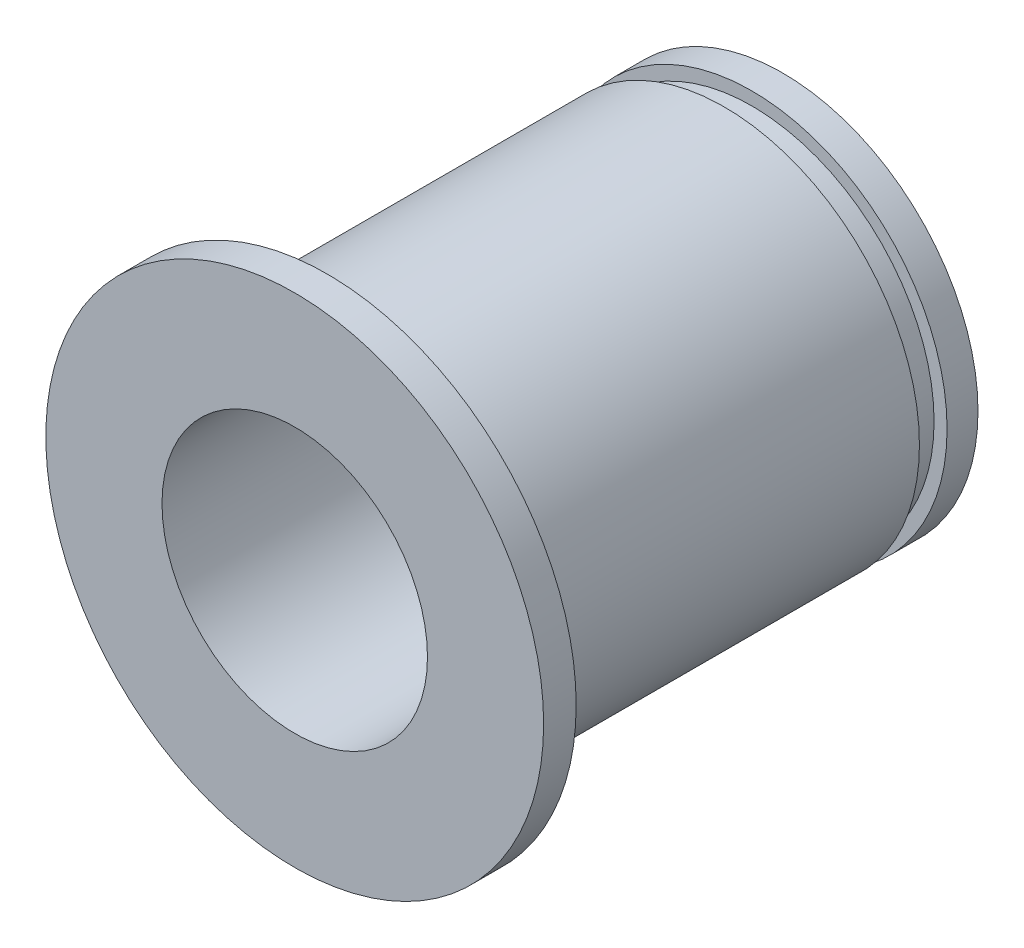
ISO-10303-21;
HEADER;
FILE_DESCRIPTION(('STEP AP214'),'2;1');
FILE_NAME('part.step','',(''),(''),'','','');
FILE_SCHEMA(('AUTOMOTIVE_DESIGN { 1 0 10303 214 1 1 1 1 }'));
ENDSEC;
DATA;
#1=APPLICATION_CONTEXT('core data for automotive mechanical design processes');
#2=APPLICATION_PROTOCOL_DEFINITION('international standard','automotive_design',2000,#1);
#3=PRODUCT_CONTEXT('',#1,'mechanical');
#4=PRODUCT('Part','Part','',(#3));
#5=PRODUCT_RELATED_PRODUCT_CATEGORY('part','',(#4));
#6=PRODUCT_DEFINITION_FORMATION('','',#4);
#7=PRODUCT_DEFINITION_CONTEXT('part definition',#1,'design');
#8=PRODUCT_DEFINITION('design','',#6,#7);
#9=PRODUCT_DEFINITION_SHAPE('','',#8);
#10=(LENGTH_UNIT() NAMED_UNIT(*) SI_UNIT(.MILLI.,.METRE.));
#11=(NAMED_UNIT(*) PLANE_ANGLE_UNIT() SI_UNIT($,.RADIAN.));
#12=(NAMED_UNIT(*) SI_UNIT($,.STERADIAN.) SOLID_ANGLE_UNIT());
#13=UNCERTAINTY_MEASURE_WITH_UNIT(LENGTH_MEASURE(1.E-05),#10,'distance_accuracy_value','');
#14=(GEOMETRIC_REPRESENTATION_CONTEXT(3) GLOBAL_UNCERTAINTY_ASSIGNED_CONTEXT((#13)) GLOBAL_UNIT_ASSIGNED_CONTEXT((#10,
#11,#12)) REPRESENTATION_CONTEXT('',''));
#15=CARTESIAN_POINT('',(0.,0.,0.));
#16=DIRECTION('',(0.,0.,1.));
#17=DIRECTION('',(1.,0.,0.));
#18=AXIS2_PLACEMENT_3D('',#15,#16,#17);
#19=CARTESIAN_POINT('',(0.,0.,12.));
#20=DIRECTION('',(0.,0.,-1.));
#21=DIRECTION('',(-1.,0.,0.));
#22=AXIS2_PLACEMENT_3D('',#19,#20,#21);
#23=CYLINDRICAL_SURFACE('',#22,6.);
#24=CARTESIAN_POINT('',(0.,0.,-2.));
#25=DIRECTION('',(0.,0.,1.));
#26=DIRECTION('',(1.,0.,0.));
#27=AXIS2_PLACEMENT_3D('',#24,#25,#26);
#28=CIRCLE('',#27,6.);
#29=CARTESIAN_POINT('',(6.,0.,-2.));
#30=VERTEX_POINT('',#29);
#31=EDGE_CURVE('E44',#30,#30,#28,.T.);
#32=ORIENTED_EDGE('',*,*,#31,.T.);
#33=EDGE_LOOP('',(#32));
#34=FACE_BOUND('',#33,.T.);
#35=CARTESIAN_POINT('',(0.,0.,-1.05));
#36=DIRECTION('',(0.,0.,1.));
#37=DIRECTION('',(1.,0.,0.));
#38=AXIS2_PLACEMENT_3D('',#35,#36,#37);
#39=CIRCLE('',#38,6.);
#40=CARTESIAN_POINT('',(6.,0.,-1.05));
#41=VERTEX_POINT('',#40);
#42=EDGE_CURVE('E53',#41,#41,#39,.T.);
#43=ORIENTED_EDGE('',*,*,#42,.F.);
#44=EDGE_LOOP('',(#43));
#45=FACE_BOUND('',#44,.T.);
#46=ADVANCED_FACE('F40',(#34,#45),#23,.T.);
#47=CARTESIAN_POINT('',(0.,0.,-2.));
#48=DIRECTION('',(0.,0.,1.));
#49=DIRECTION('',(1.,0.,0.));
#50=AXIS2_PLACEMENT_3D('',#47,#48,#49);
#51=PLANE('',#50);
#52=ORIENTED_EDGE('',*,*,#31,.F.);
#53=EDGE_LOOP('',(#52));
#54=FACE_BOUND('',#53,.T.);
#55=CARTESIAN_POINT('',(0.,0.,-2.));
#56=DIRECTION('',(0.,0.,1.));
#57=DIRECTION('',(1.,0.,0.));
#58=AXIS2_PLACEMENT_3D('',#55,#56,#57);
#59=CIRCLE('',#58,4.08);
#60=CARTESIAN_POINT('',(4.08,0.,-2.));
#61=VERTEX_POINT('',#60);
#62=EDGE_CURVE('E49',#61,#61,#59,.T.);
#63=ORIENTED_EDGE('',*,*,#62,.T.);
#64=EDGE_LOOP('',(#63));
#65=FACE_BOUND('',#64,.T.);
#66=ADVANCED_FACE('F91',(#54,#65),#51,.F.);
#67=CARTESIAN_POINT('',(0.,0.,-0.200000000000001));
#68=DIRECTION('',(0.,0.,1.));
#69=DIRECTION('',(1.,0.,0.));
#70=AXIS2_PLACEMENT_3D('',#67,#68,#69);
#71=CIRCLE('',#70,6.);
#72=CARTESIAN_POINT('',(6.,0.,-0.200000000000001));
#73=VERTEX_POINT('',#72);
#74=EDGE_CURVE('E41',#73,#73,#71,.T.);
#75=ORIENTED_EDGE('',*,*,#74,.T.);
#76=EDGE_LOOP('',(#75));
#77=FACE_BOUND('',#76,.T.);
#78=CARTESIAN_POINT('',(0.,0.,12.));
#79=DIRECTION('',(0.,0.,1.));
#80=DIRECTION('',(1.,0.,0.));
#81=AXIS2_PLACEMENT_3D('',#78,#79,#80);
#82=CIRCLE('',#81,6.);
#83=CARTESIAN_POINT('',(6.,0.,12.));
#84=VERTEX_POINT('',#83);
#85=EDGE_CURVE('E10',#84,#84,#82,.T.);
#86=ORIENTED_EDGE('',*,*,#85,.F.);
#87=EDGE_LOOP('',(#86));
#88=FACE_BOUND('',#87,.T.);
#89=ADVANCED_FACE('F39',(#77,#88),#23,.T.);
#90=CARTESIAN_POINT('',(0.,0.,12.));
#91=DIRECTION('',(0.,0.,-1.));
#92=DIRECTION('',(-1.,0.,0.));
#93=AXIS2_PLACEMENT_3D('',#90,#91,#92);
#94=CYLINDRICAL_SURFACE('',#93,4.08);
#95=ORIENTED_EDGE('',*,*,#62,.F.);
#96=EDGE_LOOP('',(#95));
#97=FACE_BOUND('',#96,.T.);
#98=CARTESIAN_POINT('',(0.,0.,13.));
#99=DIRECTION('',(0.,0.,1.));
#100=DIRECTION('',(1.,0.,0.));
#101=AXIS2_PLACEMENT_3D('',#98,#99,#100);
#102=CIRCLE('',#101,4.08);
#103=CARTESIAN_POINT('',(4.08,0.,13.));
#104=VERTEX_POINT('',#103);
#105=EDGE_CURVE('E58',#104,#104,#102,.T.);
#106=ORIENTED_EDGE('',*,*,#105,.T.);
#107=EDGE_LOOP('',(#106));
#108=FACE_BOUND('',#107,.T.);
#109=ADVANCED_FACE('F89',(#97,#108),#94,.F.);
#110=CARTESIAN_POINT('',(0.,0.,13.));
#111=DIRECTION('',(0.,0.,1.));
#112=DIRECTION('',(1.,0.,0.));
#113=AXIS2_PLACEMENT_3D('',#110,#111,#112);
#114=PLANE('',#113);
#115=CARTESIAN_POINT('',(0.,0.,13.));
#116=DIRECTION('',(0.,0.,1.));
#117=DIRECTION('',(1.,0.,0.));
#118=AXIS2_PLACEMENT_3D('',#115,#116,#117);
#119=CIRCLE('',#118,7.65);
#120=CARTESIAN_POINT('',(7.65,0.,13.));
#121=VERTEX_POINT('',#120);
#122=EDGE_CURVE('E74',#121,#121,#119,.T.);
#123=ORIENTED_EDGE('',*,*,#122,.T.);
#124=EDGE_LOOP('',(#123));
#125=FACE_BOUND('',#124,.T.);
#126=ORIENTED_EDGE('',*,*,#105,.F.);
#127=EDGE_LOOP('',(#126));
#128=FACE_BOUND('',#127,.T.);
#129=ADVANCED_FACE('F82',(#125,#128),#114,.T.);
#130=CARTESIAN_POINT('',(0.,0.,12.));
#131=DIRECTION('',(0.,0.,1.));
#132=DIRECTION('',(1.,0.,0.));
#133=AXIS2_PLACEMENT_3D('',#130,#131,#132);
#134=PLANE('',#133);
#135=ORIENTED_EDGE('',*,*,#85,.T.);
#136=EDGE_LOOP('',(#135));
#137=FACE_BOUND('',#136,.T.);
#138=CARTESIAN_POINT('',(0.,0.,12.));
#139=DIRECTION('',(0.,0.,1.));
#140=DIRECTION('',(1.,0.,0.));
#141=AXIS2_PLACEMENT_3D('',#138,#139,#140);
#142=CIRCLE('',#141,7.65);
#143=CARTESIAN_POINT('',(7.65,0.,12.));
#144=VERTEX_POINT('',#143);
#145=EDGE_CURVE('E72',#144,#144,#142,.T.);
#146=ORIENTED_EDGE('',*,*,#145,.F.);
#147=EDGE_LOOP('',(#146));
#148=FACE_BOUND('',#147,.T.);
#149=ADVANCED_FACE('F79',(#137,#148),#134,.F.);
#150=CARTESIAN_POINT('',(0.,0.,13.));
#151=DIRECTION('',(0.,0.,-1.));
#152=DIRECTION('',(-1.,0.,0.));
#153=AXIS2_PLACEMENT_3D('',#150,#151,#152);
#154=CYLINDRICAL_SURFACE('',#153,7.65);
#155=ORIENTED_EDGE('',*,*,#122,.F.);
#156=EDGE_LOOP('',(#155));
#157=FACE_BOUND('',#156,.T.);
#158=ORIENTED_EDGE('',*,*,#145,.T.);
#159=EDGE_LOOP('',(#158));
#160=FACE_BOUND('',#159,.T.);
#161=ADVANCED_FACE('F80',(#157,#160),#154,.T.);
#162=CARTESIAN_POINT('',(0.,0.,-0.2));
#163=DIRECTION('',(0.,0.,1.));
#164=DIRECTION('',(1.,0.,0.));
#165=AXIS2_PLACEMENT_3D('',#162,#163,#164);
#166=PLANE('',#165);
#167=CARTESIAN_POINT('',(0.,0.,-0.2));
#168=DIRECTION('',(0.,0.,1.));
#169=DIRECTION('',(1.,0.,0.));
#170=AXIS2_PLACEMENT_3D('',#167,#168,#169);
#171=CIRCLE('',#170,5.6);
#172=CARTESIAN_POINT('',(5.6,0.,-0.2));
#173=VERTEX_POINT('',#172);
#174=EDGE_CURVE('E57',#173,#173,#171,.T.);
#175=ORIENTED_EDGE('',*,*,#174,.T.);
#176=EDGE_LOOP('',(#175));
#177=FACE_BOUND('',#176,.T.);
#178=ORIENTED_EDGE('',*,*,#74,.F.);
#179=EDGE_LOOP('',(#178));
#180=FACE_BOUND('',#179,.T.);
#181=ADVANCED_FACE('F90',(#177,#180),#166,.F.);
#182=CARTESIAN_POINT('',(0.,0.,-1.05));
#183=DIRECTION('',(0.,0.,1.));
#184=DIRECTION('',(1.,0.,0.));
#185=AXIS2_PLACEMENT_3D('',#182,#183,#184);
#186=PLANE('',#185);
#187=CARTESIAN_POINT('',(0.,0.,-1.05));
#188=DIRECTION('',(0.,0.,1.));
#189=DIRECTION('',(1.,0.,0.));
#190=AXIS2_PLACEMENT_3D('',#187,#188,#189);
#191=CIRCLE('',#190,5.6);
#192=CARTESIAN_POINT('',(5.6,0.,-1.05));
#193=VERTEX_POINT('',#192);
#194=EDGE_CURVE('E65',#193,#193,#191,.T.);
#195=ORIENTED_EDGE('',*,*,#194,.F.);
#196=EDGE_LOOP('',(#195));
#197=FACE_BOUND('',#196,.T.);
#198=ORIENTED_EDGE('',*,*,#42,.T.);
#199=EDGE_LOOP('',(#198));
#200=FACE_BOUND('',#199,.T.);
#201=ADVANCED_FACE('F115',(#197,#200),#186,.T.);
#202=CARTESIAN_POINT('',(0.,0.,-0.2));
#203=DIRECTION('',(0.,0.,-1.));
#204=DIRECTION('',(-1.,0.,0.));
#205=AXIS2_PLACEMENT_3D('',#202,#203,#204);
#206=CYLINDRICAL_SURFACE('',#205,5.6);
#207=ORIENTED_EDGE('',*,*,#174,.F.);
#208=EDGE_LOOP('',(#207));
#209=FACE_BOUND('',#208,.T.);
#210=ORIENTED_EDGE('',*,*,#194,.T.);
#211=EDGE_LOOP('',(#210));
#212=FACE_BOUND('',#211,.T.);
#213=ADVANCED_FACE('F120',(#209,#212),#206,.T.);
#214=CLOSED_SHELL('',(#46,#66,#89,#109,#129,#149,#161,#181,#201,#213));
#215=MANIFOLD_SOLID_BREP('B2',#214);
#216=ADVANCED_BREP_SHAPE_REPRESENTATION('',(#18,#215),#14);
#217=SHAPE_DEFINITION_REPRESENTATION(#9,#216);
ENDSEC;
END-ISO-10303-21;
